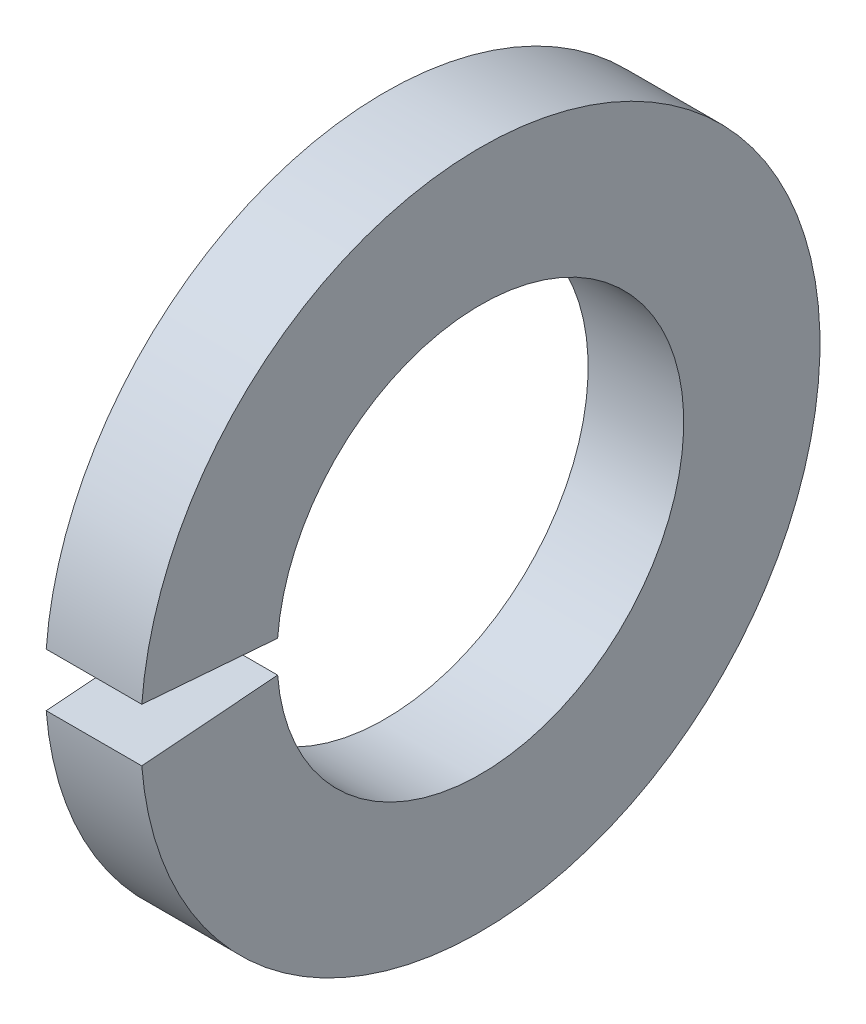
ISO-10303-21;
HEADER;
FILE_DESCRIPTION(('STEP AP214'),'2;1');
FILE_NAME('part.step','',(''),(''),'','','');
FILE_SCHEMA(('AUTOMOTIVE_DESIGN { 1 0 10303 214 1 1 1 1 }'));
ENDSEC;
DATA;
#1=APPLICATION_CONTEXT('core data for automotive mechanical design processes');
#2=APPLICATION_PROTOCOL_DEFINITION('international standard','automotive_design',2000,#1);
#3=PRODUCT_CONTEXT('',#1,'mechanical');
#4=PRODUCT('Part','Part','',(#3));
#5=PRODUCT_RELATED_PRODUCT_CATEGORY('part','',(#4));
#6=PRODUCT_DEFINITION_FORMATION('','',#4);
#7=PRODUCT_DEFINITION_CONTEXT('part definition',#1,'design');
#8=PRODUCT_DEFINITION('design','',#6,#7);
#9=PRODUCT_DEFINITION_SHAPE('','',#8);
#10=(LENGTH_UNIT() NAMED_UNIT(*) SI_UNIT(.MILLI.,.METRE.));
#11=(NAMED_UNIT(*) PLANE_ANGLE_UNIT() SI_UNIT($,.RADIAN.));
#12=(NAMED_UNIT(*) SI_UNIT($,.STERADIAN.) SOLID_ANGLE_UNIT());
#13=UNCERTAINTY_MEASURE_WITH_UNIT(LENGTH_MEASURE(1.E-05),#10,'distance_accuracy_value','');
#14=(GEOMETRIC_REPRESENTATION_CONTEXT(3) GLOBAL_UNCERTAINTY_ASSIGNED_CONTEXT((#13)) GLOBAL_UNIT_ASSIGNED_CONTEXT((#10,
#11,#12)) REPRESENTATION_CONTEXT('',''));
#15=CARTESIAN_POINT('',(0.,0.,0.));
#16=DIRECTION('',(0.,0.,1.));
#17=DIRECTION('',(1.,0.,0.));
#18=AXIS2_PLACEMENT_3D('',#15,#16,#17);
#19=CARTESIAN_POINT('',(-1.1938,0.199286103148732,2.53217002768214));
#20=DIRECTION('',(-1.,0.,0.));
#21=DIRECTION('',(0.,0.,1.));
#22=AXIS2_PLACEMENT_3D('',#19,#20,#21);
#23=PLANE('',#22);
#24=CARTESIAN_POINT('',(-1.1938,0.,0.));
#25=DIRECTION('',(-1.,0.,0.));
#26=DIRECTION('',(0.,0.,1.));
#27=AXIS2_PLACEMENT_3D('',#24,#25,#26);
#28=CIRCLE('',#27,4.2418);
#29=CARTESIAN_POINT('',(-1.1938,0.332807792258382,4.22872394622918));
#30=VERTEX_POINT('',#29);
#31=CARTESIAN_POINT('',(-1.1938,-0.332807792258376,4.22872394622918));
#32=VERTEX_POINT('',#31);
#33=EDGE_CURVE('E11',#30,#32,#28,.T.);
#34=ORIENTED_EDGE('',*,*,#33,.T.);
#35=DIRECTION('',(0.,-0.0784590957278457,0.996917333733128));
#36=VECTOR('',#35,1.);
#37=CARTESIAN_POINT('',(-1.1938,-0.199286103148728,2.53217002768214));
#38=LINE('',#37,#36);
#39=CARTESIAN_POINT('',(-1.1938,-0.199286103148728,2.53217002768214));
#40=VERTEX_POINT('',#39);
#41=EDGE_CURVE('E73',#40,#32,#38,.T.);
#42=ORIENTED_EDGE('',*,*,#41,.F.);
#43=CARTESIAN_POINT('',(-1.1938,0.,0.));
#44=DIRECTION('',(-1.,0.,0.));
#45=DIRECTION('',(0.,0.,1.));
#46=AXIS2_PLACEMENT_3D('',#43,#44,#45);
#47=CIRCLE('',#46,2.54);
#48=CARTESIAN_POINT('',(-1.1938,0.199286103148732,2.53217002768214));
#49=VERTEX_POINT('',#48);
#50=EDGE_CURVE('E48',#49,#40,#47,.T.);
#51=ORIENTED_EDGE('',*,*,#50,.F.);
#52=DIRECTION('',(0.,0.0784590957278471,0.996917333733128));
#53=VECTOR('',#52,1.);
#54=CARTESIAN_POINT('',(-1.1938,0.199286103148732,2.53217002768214));
#55=LINE('',#54,#53);
#56=EDGE_CURVE('E75',#49,#30,#55,.T.);
#57=ORIENTED_EDGE('',*,*,#56,.T.);
#58=EDGE_LOOP('',(#34,#42,#51,#57));
#59=FACE_BOUND('',#58,.T.);
#60=ADVANCED_FACE('F33',(#59),#23,.T.);
#61=CARTESIAN_POINT('',(0.,0.,0.));
#62=DIRECTION('',(-1.,0.,0.));
#63=DIRECTION('',(0.,0.,1.));
#64=AXIS2_PLACEMENT_3D('',#61,#62,#63);
#65=CYLINDRICAL_SURFACE('',#64,4.2418);
#66=CARTESIAN_POINT('',(0.,0.,0.));
#67=DIRECTION('',(-1.,0.,0.));
#68=DIRECTION('',(0.,0.,1.));
#69=AXIS2_PLACEMENT_3D('',#66,#67,#68);
#70=CIRCLE('',#69,4.2418);
#71=CARTESIAN_POINT('',(0.,0.332807792258382,4.22872394622918));
#72=VERTEX_POINT('',#71);
#73=CARTESIAN_POINT('',(0.,-0.332807792258376,4.22872394622918));
#74=VERTEX_POINT('',#73);
#75=EDGE_CURVE('E41',#72,#74,#70,.T.);
#76=ORIENTED_EDGE('',*,*,#75,.T.);
#77=DIRECTION('',(1.,0.,0.));
#78=VECTOR('',#77,1.);
#79=CARTESIAN_POINT('',(-1.1938,-0.332807792258376,4.22872394622918));
#80=LINE('',#79,#78);
#81=EDGE_CURVE('E84',#32,#74,#80,.T.);
#82=ORIENTED_EDGE('',*,*,#81,.F.);
#83=ORIENTED_EDGE('',*,*,#33,.F.);
#84=DIRECTION('',(1.,0.,0.));
#85=VECTOR('',#84,1.);
#86=CARTESIAN_POINT('',(-1.1938,0.332807792258382,4.22872394622918));
#87=LINE('',#86,#85);
#88=EDGE_CURVE('E94',#30,#72,#87,.T.);
#89=ORIENTED_EDGE('',*,*,#88,.T.);
#90=EDGE_LOOP('',(#76,#82,#83,#89));
#91=FACE_BOUND('',#90,.T.);
#92=ADVANCED_FACE('F35',(#91),#65,.T.);
#93=CARTESIAN_POINT('',(0.,0.332807792258382,4.22872394622918));
#94=DIRECTION('',(1.,0.,0.));
#95=DIRECTION('',(0.,0.,-1.));
#96=AXIS2_PLACEMENT_3D('',#93,#94,#95);
#97=PLANE('',#96);
#98=CARTESIAN_POINT('',(0.,0.,0.));
#99=DIRECTION('',(-1.,0.,0.));
#100=DIRECTION('',(0.,0.,1.));
#101=AXIS2_PLACEMENT_3D('',#98,#99,#100);
#102=CIRCLE('',#101,2.54);
#103=CARTESIAN_POINT('',(0.,0.199286103148732,2.53217002768214));
#104=VERTEX_POINT('',#103);
#105=CARTESIAN_POINT('',(0.,-0.199286103148728,2.53217002768214));
#106=VERTEX_POINT('',#105);
#107=EDGE_CURVE('E56',#104,#106,#102,.T.);
#108=ORIENTED_EDGE('',*,*,#107,.T.);
#109=DIRECTION('',(0.,0.0784590957278457,-0.996917333733128));
#110=VECTOR('',#109,1.);
#111=CARTESIAN_POINT('',(0.,-0.332807792258376,4.22872394622918));
#112=LINE('',#111,#110);
#113=EDGE_CURVE('E88',#74,#106,#112,.T.);
#114=ORIENTED_EDGE('',*,*,#113,.F.);
#115=ORIENTED_EDGE('',*,*,#75,.F.);
#116=DIRECTION('',(0.,-0.0784590957278471,-0.996917333733128));
#117=VECTOR('',#116,1.);
#118=CARTESIAN_POINT('',(0.,0.332807792258382,4.22872394622918));
#119=LINE('',#118,#117);
#120=EDGE_CURVE('E96',#72,#104,#119,.T.);
#121=ORIENTED_EDGE('',*,*,#120,.T.);
#122=EDGE_LOOP('',(#108,#114,#115,#121));
#123=FACE_BOUND('',#122,.T.);
#124=ADVANCED_FACE('F102',(#123),#97,.T.);
#125=CARTESIAN_POINT('',(0.,0.,0.));
#126=DIRECTION('',(-1.,0.,0.));
#127=DIRECTION('',(0.,0.,1.));
#128=AXIS2_PLACEMENT_3D('',#125,#126,#127);
#129=CYLINDRICAL_SURFACE('',#128,2.54);
#130=DIRECTION('',(-1.,0.,0.));
#131=VECTOR('',#130,1.);
#132=CARTESIAN_POINT('',(0.,0.199286103148732,2.53217002768214));
#133=LINE('',#132,#131);
#134=EDGE_CURVE('E98',#104,#49,#133,.T.);
#135=ORIENTED_EDGE('',*,*,#134,.T.);
#136=ORIENTED_EDGE('',*,*,#50,.T.);
#137=DIRECTION('',(-1.,0.,0.));
#138=VECTOR('',#137,1.);
#139=CARTESIAN_POINT('',(0.,-0.199286103148728,2.53217002768214));
#140=LINE('',#139,#138);
#141=EDGE_CURVE('E86',#106,#40,#140,.T.);
#142=ORIENTED_EDGE('',*,*,#141,.F.);
#143=ORIENTED_EDGE('',*,*,#107,.F.);
#144=EDGE_LOOP('',(#135,#136,#142,#143));
#145=FACE_BOUND('',#144,.T.);
#146=ADVANCED_FACE('F105',(#145),#129,.F.);
#147=CARTESIAN_POINT('',(0.,0.,0.));
#148=DIRECTION('',(0.,0.996917333733128,-0.0784590957278471));
#149=DIRECTION('',(0.,0.0784590957278471,0.996917333733128));
#150=AXIS2_PLACEMENT_3D('',#147,#148,#149);
#151=PLANE('',#150);
#152=ORIENTED_EDGE('',*,*,#56,.F.);
#153=ORIENTED_EDGE('',*,*,#134,.F.);
#154=ORIENTED_EDGE('',*,*,#120,.F.);
#155=ORIENTED_EDGE('',*,*,#88,.F.);
#156=EDGE_LOOP('',(#152,#153,#154,#155));
#157=FACE_BOUND('',#156,.T.);
#158=ADVANCED_FACE('F107',(#157),#151,.F.);
#159=CARTESIAN_POINT('',(0.,0.,0.));
#160=DIRECTION('',(0.,0.996917333733128,0.0784590957278457));
#161=DIRECTION('',(0.,-0.0784590957278457,0.996917333733128));
#162=AXIS2_PLACEMENT_3D('',#159,#160,#161);
#163=PLANE('',#162);
#164=ORIENTED_EDGE('',*,*,#41,.T.);
#165=ORIENTED_EDGE('',*,*,#81,.T.);
#166=ORIENTED_EDGE('',*,*,#113,.T.);
#167=ORIENTED_EDGE('',*,*,#141,.T.);
#168=EDGE_LOOP('',(#164,#165,#166,#167));
#169=FACE_BOUND('',#168,.T.);
#170=ADVANCED_FACE('F82',(#169),#163,.T.);
#171=CLOSED_SHELL('',(#60,#92,#124,#146,#158,#170));
#172=MANIFOLD_SOLID_BREP('B2',#171);
#173=ADVANCED_BREP_SHAPE_REPRESENTATION('',(#18,#172),#14);
#174=SHAPE_DEFINITION_REPRESENTATION(#9,#173);
ENDSEC;
END-ISO-10303-21;
